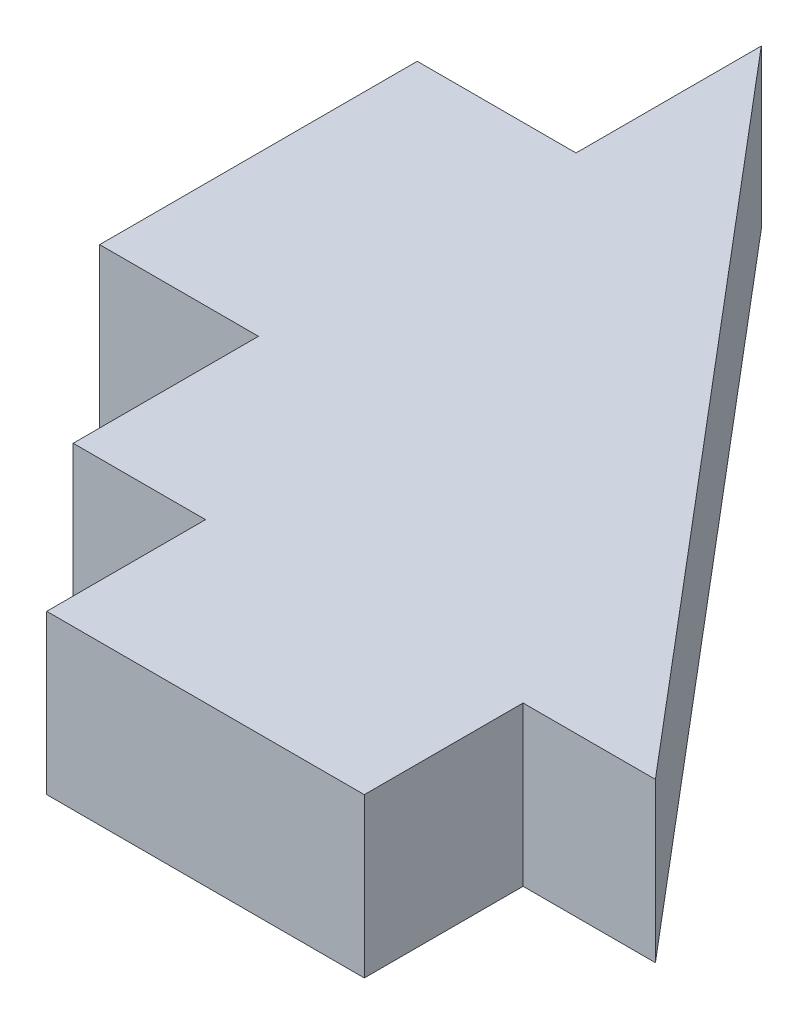
ISO-10303-21;
HEADER;
FILE_DESCRIPTION(('STEP AP214'),'2;1');
FILE_NAME('part.step','',(''),(''),'','','');
FILE_SCHEMA(('AUTOMOTIVE_DESIGN { 1 0 10303 214 1 1 1 1 }'));
ENDSEC;
DATA;
#1=APPLICATION_CONTEXT('core data for automotive mechanical design processes');
#2=APPLICATION_PROTOCOL_DEFINITION('international standard','automotive_design',2000,#1);
#3=PRODUCT_CONTEXT('',#1,'mechanical');
#4=PRODUCT('Part','Part','',(#3));
#5=PRODUCT_RELATED_PRODUCT_CATEGORY('part','',(#4));
#6=PRODUCT_DEFINITION_FORMATION('','',#4);
#7=PRODUCT_DEFINITION_CONTEXT('part definition',#1,'design');
#8=PRODUCT_DEFINITION('design','',#6,#7);
#9=PRODUCT_DEFINITION_SHAPE('','',#8);
#10=(LENGTH_UNIT() NAMED_UNIT(*) SI_UNIT(.MILLI.,.METRE.));
#11=(NAMED_UNIT(*) PLANE_ANGLE_UNIT() SI_UNIT($,.RADIAN.));
#12=(NAMED_UNIT(*) SI_UNIT($,.STERADIAN.) SOLID_ANGLE_UNIT());
#13=UNCERTAINTY_MEASURE_WITH_UNIT(LENGTH_MEASURE(1.E-05),#10,'distance_accuracy_value','');
#14=(GEOMETRIC_REPRESENTATION_CONTEXT(3) GLOBAL_UNCERTAINTY_ASSIGNED_CONTEXT((#13)) GLOBAL_UNIT_ASSIGNED_CONTEXT((#10,
#11,#12)) REPRESENTATION_CONTEXT('',''));
#15=CARTESIAN_POINT('',(0.,0.,0.));
#16=DIRECTION('',(0.,0.,1.));
#17=DIRECTION('',(1.,0.,0.));
#18=AXIS2_PLACEMENT_3D('',#15,#16,#17);
#19=CARTESIAN_POINT('',(0.,3.,0.));
#20=DIRECTION('',(1.,0.,0.));
#21=DIRECTION('',(0.,0.,-1.));
#22=AXIS2_PLACEMENT_3D('',#19,#20,#21);
#23=PLANE('',#22);
#24=DIRECTION('',(0.,0.,1.));
#25=VECTOR('',#24,1.);
#26=CARTESIAN_POINT('',(0.,0.,0.));
#27=LINE('',#26,#25);
#28=CARTESIAN_POINT('',(0.,0.,-3.5));
#29=VERTEX_POINT('',#28);
#30=CARTESIAN_POINT('',(0.,0.,0.));
#31=VERTEX_POINT('',#30);
#32=EDGE_CURVE('E147',#29,#31,#27,.T.);
#33=ORIENTED_EDGE('',*,*,#32,.T.);
#34=DIRECTION('',(0.,-1.,0.));
#35=VECTOR('',#34,1.);
#36=CARTESIAN_POINT('',(0.,3.,0.));
#37=LINE('',#36,#35);
#38=CARTESIAN_POINT('',(0.,3.,0.));
#39=VERTEX_POINT('',#38);
#40=EDGE_CURVE('E11',#39,#31,#37,.T.);
#41=ORIENTED_EDGE('',*,*,#40,.F.);
#42=DIRECTION('',(0.,0.,1.));
#43=VECTOR('',#42,1.);
#44=CARTESIAN_POINT('',(0.,3.,0.));
#45=LINE('',#44,#43);
#46=CARTESIAN_POINT('',(0.,3.,-3.5));
#47=VERTEX_POINT('',#46);
#48=EDGE_CURVE('E168',#47,#39,#45,.T.);
#49=ORIENTED_EDGE('',*,*,#48,.F.);
#50=DIRECTION('',(0.,-1.,0.));
#51=VECTOR('',#50,1.);
#52=CARTESIAN_POINT('',(0.,3.,-3.5));
#53=LINE('',#52,#51);
#54=EDGE_CURVE('E143',#47,#29,#53,.T.);
#55=ORIENTED_EDGE('',*,*,#54,.T.);
#56=EDGE_LOOP('',(#33,#41,#49,#55));
#57=FACE_BOUND('',#56,.T.);
#58=ADVANCED_FACE('F33',(#57),#23,.F.);
#59=CARTESIAN_POINT('',(0.,3.,0.));
#60=DIRECTION('',(0.,0.,-1.));
#61=DIRECTION('',(-1.,0.,0.));
#62=AXIS2_PLACEMENT_3D('',#59,#60,#61);
#63=PLANE('',#62);
#64=DIRECTION('',(1.,0.,0.));
#65=VECTOR('',#64,1.);
#66=CARTESIAN_POINT('',(0.,0.,0.));
#67=LINE('',#66,#65);
#68=CARTESIAN_POINT('',(2.5,0.,0.));
#69=VERTEX_POINT('',#68);
#70=EDGE_CURVE('E150',#31,#69,#67,.T.);
#71=ORIENTED_EDGE('',*,*,#70,.T.);
#72=DIRECTION('',(0.,-1.,0.));
#73=VECTOR('',#72,1.);
#74=CARTESIAN_POINT('',(2.5,3.,0.));
#75=LINE('',#74,#73);
#76=CARTESIAN_POINT('',(2.5,3.,0.));
#77=VERTEX_POINT('',#76);
#78=EDGE_CURVE('E41',#77,#69,#75,.T.);
#79=ORIENTED_EDGE('',*,*,#78,.F.);
#80=DIRECTION('',(1.,0.,0.));
#81=VECTOR('',#80,1.);
#82=CARTESIAN_POINT('',(0.,3.,0.));
#83=LINE('',#82,#81);
#84=EDGE_CURVE('E101',#39,#77,#83,.T.);
#85=ORIENTED_EDGE('',*,*,#84,.F.);
#86=ORIENTED_EDGE('',*,*,#40,.T.);
#87=EDGE_LOOP('',(#71,#79,#85,#86));
#88=FACE_BOUND('',#87,.T.);
#89=ADVANCED_FACE('F239',(#88),#63,.F.);
#90=CARTESIAN_POINT('',(2.5,3.,3.));
#91=DIRECTION('',(1.,0.,0.));
#92=DIRECTION('',(0.,0.,-1.));
#93=AXIS2_PLACEMENT_3D('',#90,#91,#92);
#94=PLANE('',#93);
#95=DIRECTION('',(0.,0.,1.));
#96=VECTOR('',#95,1.);
#97=CARTESIAN_POINT('',(2.5,0.,3.));
#98=LINE('',#97,#96);
#99=CARTESIAN_POINT('',(2.5,0.,3.));
#100=VERTEX_POINT('',#99);
#101=EDGE_CURVE('E152',#69,#100,#98,.T.);
#102=ORIENTED_EDGE('',*,*,#101,.T.);
#103=DIRECTION('',(0.,-1.,0.));
#104=VECTOR('',#103,1.);
#105=CARTESIAN_POINT('',(2.5,3.,3.));
#106=LINE('',#105,#104);
#107=CARTESIAN_POINT('',(2.5,3.,3.));
#108=VERTEX_POINT('',#107);
#109=EDGE_CURVE('E184',#108,#100,#106,.T.);
#110=ORIENTED_EDGE('',*,*,#109,.F.);
#111=DIRECTION('',(0.,0.,1.));
#112=VECTOR('',#111,1.);
#113=CARTESIAN_POINT('',(2.5,3.,3.));
#114=LINE('',#113,#112);
#115=EDGE_CURVE('E192',#77,#108,#114,.T.);
#116=ORIENTED_EDGE('',*,*,#115,.F.);
#117=ORIENTED_EDGE('',*,*,#78,.T.);
#118=EDGE_LOOP('',(#102,#110,#116,#117));
#119=FACE_BOUND('',#118,.T.);
#120=ADVANCED_FACE('F190',(#119),#94,.F.);
#121=CARTESIAN_POINT('',(5.5,3.,3.));
#122=DIRECTION('',(0.,0.,-1.));
#123=DIRECTION('',(-1.,0.,0.));
#124=AXIS2_PLACEMENT_3D('',#121,#122,#123);
#125=PLANE('',#124);
#126=DIRECTION('',(1.,0.,0.));
#127=VECTOR('',#126,1.);
#128=CARTESIAN_POINT('',(5.5,0.,3.));
#129=LINE('',#128,#127);
#130=CARTESIAN_POINT('',(8.5,0.,3.));
#131=VERTEX_POINT('',#130);
#132=EDGE_CURVE('E155',#100,#131,#129,.T.);
#133=ORIENTED_EDGE('',*,*,#132,.T.);
#134=DIRECTION('',(0.,-1.,0.));
#135=VECTOR('',#134,1.);
#136=CARTESIAN_POINT('',(8.5,3.,3.));
#137=LINE('',#136,#135);
#138=CARTESIAN_POINT('',(8.5,3.,3.));
#139=VERTEX_POINT('',#138);
#140=EDGE_CURVE('E181',#139,#131,#137,.T.);
#141=ORIENTED_EDGE('',*,*,#140,.F.);
#142=DIRECTION('',(1.,0.,0.));
#143=VECTOR('',#142,1.);
#144=CARTESIAN_POINT('',(5.5,3.,3.));
#145=LINE('',#144,#143);
#146=EDGE_CURVE('E209',#108,#139,#145,.T.);
#147=ORIENTED_EDGE('',*,*,#146,.F.);
#148=ORIENTED_EDGE('',*,*,#109,.T.);
#149=EDGE_LOOP('',(#133,#141,#147,#148));
#150=FACE_BOUND('',#149,.T.);
#151=ADVANCED_FACE('F200',(#150),#125,.F.);
#152=CARTESIAN_POINT('',(8.5,3.,3.));
#153=DIRECTION('',(-1.,0.,0.));
#154=DIRECTION('',(0.,0.,1.));
#155=AXIS2_PLACEMENT_3D('',#152,#153,#154);
#156=PLANE('',#155);
#157=DIRECTION('',(0.,0.,-1.));
#158=VECTOR('',#157,1.);
#159=CARTESIAN_POINT('',(8.5,0.,3.));
#160=LINE('',#159,#158);
#161=CARTESIAN_POINT('',(8.5,0.,0.));
#162=VERTEX_POINT('',#161);
#163=EDGE_CURVE('E157',#131,#162,#160,.T.);
#164=ORIENTED_EDGE('',*,*,#163,.T.);
#165=DIRECTION('',(0.,-1.,0.));
#166=VECTOR('',#165,1.);
#167=CARTESIAN_POINT('',(8.5,3.,0.));
#168=LINE('',#167,#166);
#169=CARTESIAN_POINT('',(8.5,3.,0.));
#170=VERTEX_POINT('',#169);
#171=EDGE_CURVE('E178',#170,#162,#168,.T.);
#172=ORIENTED_EDGE('',*,*,#171,.F.);
#173=DIRECTION('',(0.,0.,-1.));
#174=VECTOR('',#173,1.);
#175=CARTESIAN_POINT('',(8.5,3.,3.));
#176=LINE('',#175,#174);
#177=EDGE_CURVE('E206',#139,#170,#176,.T.);
#178=ORIENTED_EDGE('',*,*,#177,.F.);
#179=ORIENTED_EDGE('',*,*,#140,.T.);
#180=EDGE_LOOP('',(#164,#172,#178,#179));
#181=FACE_BOUND('',#180,.T.);
#182=ADVANCED_FACE('F204',(#181),#156,.F.);
#183=CARTESIAN_POINT('',(8.5,3.,0.));
#184=DIRECTION('',(0.,0.,-1.));
#185=DIRECTION('',(-1.,0.,0.));
#186=AXIS2_PLACEMENT_3D('',#183,#184,#185);
#187=PLANE('',#186);
#188=DIRECTION('',(1.,0.,0.));
#189=VECTOR('',#188,1.);
#190=CARTESIAN_POINT('',(8.5,0.,0.));
#191=LINE('',#190,#189);
#192=CARTESIAN_POINT('',(11.,0.,0.));
#193=VERTEX_POINT('',#192);
#194=EDGE_CURVE('E159',#162,#193,#191,.T.);
#195=ORIENTED_EDGE('',*,*,#194,.T.);
#196=DIRECTION('',(0.,-1.,0.));
#197=VECTOR('',#196,1.);
#198=CARTESIAN_POINT('',(11.,3.,0.));
#199=LINE('',#198,#197);
#200=CARTESIAN_POINT('',(11.,3.,0.));
#201=VERTEX_POINT('',#200);
#202=EDGE_CURVE('E175',#201,#193,#199,.T.);
#203=ORIENTED_EDGE('',*,*,#202,.F.);
#204=DIRECTION('',(1.,0.,0.));
#205=VECTOR('',#204,1.);
#206=CARTESIAN_POINT('',(8.5,3.,0.));
#207=LINE('',#206,#205);
#208=EDGE_CURVE('E208',#170,#201,#207,.T.);
#209=ORIENTED_EDGE('',*,*,#208,.F.);
#210=ORIENTED_EDGE('',*,*,#171,.T.);
#211=EDGE_LOOP('',(#195,#203,#209,#210));
#212=FACE_BOUND('',#211,.T.);
#213=ADVANCED_FACE('F252',(#212),#187,.F.);
#214=CARTESIAN_POINT('',(0.,3.,-13.));
#215=DIRECTION('',(-0.763386285369114,0.,0.645942241466174));
#216=DIRECTION('',(0.645942241466174,0.,0.763386285369115));
#217=AXIS2_PLACEMENT_3D('',#214,#215,#216);
#218=PLANE('',#217);
#219=DIRECTION('',(-0.645942241466174,0.,-0.763386285369115));
#220=VECTOR('',#219,1.);
#221=CARTESIAN_POINT('',(0.,0.,-13.));
#222=LINE('',#221,#220);
#223=CARTESIAN_POINT('',(0.,0.,-13.));
#224=VERTEX_POINT('',#223);
#225=EDGE_CURVE('E161',#193,#224,#222,.T.);
#226=ORIENTED_EDGE('',*,*,#225,.T.);
#227=DIRECTION('',(0.,-1.,0.));
#228=VECTOR('',#227,1.);
#229=CARTESIAN_POINT('',(0.,3.,-13.));
#230=LINE('',#229,#228);
#231=CARTESIAN_POINT('',(0.,3.,-13.));
#232=VERTEX_POINT('',#231);
#233=EDGE_CURVE('E172',#232,#224,#230,.T.);
#234=ORIENTED_EDGE('',*,*,#233,.F.);
#235=DIRECTION('',(-0.645942241466174,0.,-0.763386285369115));
#236=VECTOR('',#235,1.);
#237=CARTESIAN_POINT('',(0.,3.,-13.));
#238=LINE('',#237,#236);
#239=EDGE_CURVE('E211',#201,#232,#238,.T.);
#240=ORIENTED_EDGE('',*,*,#239,.F.);
#241=ORIENTED_EDGE('',*,*,#202,.T.);
#242=EDGE_LOOP('',(#226,#234,#240,#241));
#243=FACE_BOUND('',#242,.T.);
#244=ADVANCED_FACE('F220',(#243),#218,.F.);
#245=CARTESIAN_POINT('',(0.,3.,-9.5));
#246=DIRECTION('',(1.,0.,0.));
#247=DIRECTION('',(0.,0.,-1.));
#248=AXIS2_PLACEMENT_3D('',#245,#246,#247);
#249=PLANE('',#248);
#250=DIRECTION('',(0.,0.,1.));
#251=VECTOR('',#250,1.);
#252=CARTESIAN_POINT('',(0.,0.,-9.5));
#253=LINE('',#252,#251);
#254=CARTESIAN_POINT('',(0.,0.,-9.5));
#255=VERTEX_POINT('',#254);
#256=EDGE_CURVE('E163',#224,#255,#253,.T.);
#257=ORIENTED_EDGE('',*,*,#256,.T.);
#258=DIRECTION('',(0.,-1.,0.));
#259=VECTOR('',#258,1.);
#260=CARTESIAN_POINT('',(0.,3.,-9.5));
#261=LINE('',#260,#259);
#262=CARTESIAN_POINT('',(0.,3.,-9.5));
#263=VERTEX_POINT('',#262);
#264=EDGE_CURVE('E138',#263,#255,#261,.T.);
#265=ORIENTED_EDGE('',*,*,#264,.F.);
#266=DIRECTION('',(0.,0.,1.));
#267=VECTOR('',#266,1.);
#268=CARTESIAN_POINT('',(0.,3.,-9.5));
#269=LINE('',#268,#267);
#270=EDGE_CURVE('E129',#232,#263,#269,.T.);
#271=ORIENTED_EDGE('',*,*,#270,.F.);
#272=ORIENTED_EDGE('',*,*,#233,.T.);
#273=EDGE_LOOP('',(#257,#265,#271,#272));
#274=FACE_BOUND('',#273,.T.);
#275=ADVANCED_FACE('F224',(#274),#249,.F.);
#276=CARTESIAN_POINT('',(-3.,3.,-9.5));
#277=DIRECTION('',(0.,0.,1.));
#278=DIRECTION('',(1.,0.,0.));
#279=AXIS2_PLACEMENT_3D('',#276,#277,#278);
#280=PLANE('',#279);
#281=DIRECTION('',(-1.,0.,0.));
#282=VECTOR('',#281,1.);
#283=CARTESIAN_POINT('',(-3.,0.,-9.5));
#284=LINE('',#283,#282);
#285=CARTESIAN_POINT('',(-3.,0.,-9.5));
#286=VERTEX_POINT('',#285);
#287=EDGE_CURVE('E137',#255,#286,#284,.T.);
#288=ORIENTED_EDGE('',*,*,#287,.T.);
#289=DIRECTION('',(0.,-1.,0.));
#290=VECTOR('',#289,1.);
#291=CARTESIAN_POINT('',(-3.,3.,-9.5));
#292=LINE('',#291,#290);
#293=CARTESIAN_POINT('',(-3.,3.,-9.5));
#294=VERTEX_POINT('',#293);
#295=EDGE_CURVE('E134',#294,#286,#292,.T.);
#296=ORIENTED_EDGE('',*,*,#295,.F.);
#297=DIRECTION('',(-1.,0.,0.));
#298=VECTOR('',#297,1.);
#299=CARTESIAN_POINT('',(-3.,3.,-9.5));
#300=LINE('',#299,#298);
#301=EDGE_CURVE('E123',#263,#294,#300,.T.);
#302=ORIENTED_EDGE('',*,*,#301,.F.);
#303=ORIENTED_EDGE('',*,*,#264,.T.);
#304=EDGE_LOOP('',(#288,#296,#302,#303));
#305=FACE_BOUND('',#304,.T.);
#306=ADVANCED_FACE('F135',(#305),#280,.F.);
#307=CARTESIAN_POINT('',(-3.,3.,-3.5));
#308=DIRECTION('',(1.,0.,0.));
#309=DIRECTION('',(0.,0.,-1.));
#310=AXIS2_PLACEMENT_3D('',#307,#308,#309);
#311=PLANE('',#310);
#312=DIRECTION('',(0.,0.,1.));
#313=VECTOR('',#312,1.);
#314=CARTESIAN_POINT('',(-3.,0.,-3.5));
#315=LINE('',#314,#313);
#316=CARTESIAN_POINT('',(-3.,0.,-3.5));
#317=VERTEX_POINT('',#316);
#318=EDGE_CURVE('E87',#286,#317,#315,.T.);
#319=ORIENTED_EDGE('',*,*,#318,.T.);
#320=DIRECTION('',(0.,-1.,0.));
#321=VECTOR('',#320,1.);
#322=CARTESIAN_POINT('',(-3.,3.,-3.5));
#323=LINE('',#322,#321);
#324=CARTESIAN_POINT('',(-3.,3.,-3.5));
#325=VERTEX_POINT('',#324);
#326=EDGE_CURVE('E139',#325,#317,#323,.T.);
#327=ORIENTED_EDGE('',*,*,#326,.F.);
#328=DIRECTION('',(0.,0.,1.));
#329=VECTOR('',#328,1.);
#330=CARTESIAN_POINT('',(-3.,3.,-3.5));
#331=LINE('',#330,#329);
#332=EDGE_CURVE('E127',#294,#325,#331,.T.);
#333=ORIENTED_EDGE('',*,*,#332,.F.);
#334=ORIENTED_EDGE('',*,*,#295,.T.);
#335=EDGE_LOOP('',(#319,#327,#333,#334));
#336=FACE_BOUND('',#335,.T.);
#337=ADVANCED_FACE('F141',(#336),#311,.F.);
#338=CARTESIAN_POINT('',(-3.,3.,-3.5));
#339=DIRECTION('',(0.,0.,-1.));
#340=DIRECTION('',(-1.,0.,0.));
#341=AXIS2_PLACEMENT_3D('',#338,#339,#340);
#342=PLANE('',#341);
#343=DIRECTION('',(1.,0.,0.));
#344=VECTOR('',#343,1.);
#345=CARTESIAN_POINT('',(-3.,0.,-3.5));
#346=LINE('',#345,#344);
#347=EDGE_CURVE('E93',#317,#29,#346,.T.);
#348=ORIENTED_EDGE('',*,*,#347,.T.);
#349=ORIENTED_EDGE('',*,*,#54,.F.);
#350=DIRECTION('',(1.,0.,0.));
#351=VECTOR('',#350,1.);
#352=CARTESIAN_POINT('',(-3.,3.,-3.5));
#353=LINE('',#352,#351);
#354=EDGE_CURVE('E49',#325,#47,#353,.T.);
#355=ORIENTED_EDGE('',*,*,#354,.F.);
#356=ORIENTED_EDGE('',*,*,#326,.T.);
#357=EDGE_LOOP('',(#348,#349,#355,#356));
#358=FACE_BOUND('',#357,.T.);
#359=ADVANCED_FACE('F228',(#358),#342,.F.);
#360=CARTESIAN_POINT('',(0.,3.,0.));
#361=DIRECTION('',(0.,-1.,0.));
#362=DIRECTION('',(0.,0.,-1.));
#363=AXIS2_PLACEMENT_3D('',#360,#361,#362);
#364=PLANE('',#363);
#365=ORIENTED_EDGE('',*,*,#48,.T.);
#366=ORIENTED_EDGE('',*,*,#84,.T.);
#367=ORIENTED_EDGE('',*,*,#115,.T.);
#368=ORIENTED_EDGE('',*,*,#146,.T.);
#369=ORIENTED_EDGE('',*,*,#177,.T.);
#370=ORIENTED_EDGE('',*,*,#208,.T.);
#371=ORIENTED_EDGE('',*,*,#239,.T.);
#372=ORIENTED_EDGE('',*,*,#270,.T.);
#373=ORIENTED_EDGE('',*,*,#301,.T.);
#374=ORIENTED_EDGE('',*,*,#332,.T.);
#375=ORIENTED_EDGE('',*,*,#354,.T.);
#376=EDGE_LOOP('',(#365,#366,#367,#368,#369,#370,#371,#372,#373,#374,#375));
#377=FACE_BOUND('',#376,.T.);
#378=ADVANCED_FACE('F125',(#377),#364,.F.);
#379=CARTESIAN_POINT('',(0.,0.,0.));
#380=DIRECTION('',(0.,-1.,0.));
#381=DIRECTION('',(0.,0.,-1.));
#382=AXIS2_PLACEMENT_3D('',#379,#380,#381);
#383=PLANE('',#382);
#384=ORIENTED_EDGE('',*,*,#32,.F.);
#385=ORIENTED_EDGE('',*,*,#347,.F.);
#386=ORIENTED_EDGE('',*,*,#318,.F.);
#387=ORIENTED_EDGE('',*,*,#287,.F.);
#388=ORIENTED_EDGE('',*,*,#256,.F.);
#389=ORIENTED_EDGE('',*,*,#225,.F.);
#390=ORIENTED_EDGE('',*,*,#194,.F.);
#391=ORIENTED_EDGE('',*,*,#163,.F.);
#392=ORIENTED_EDGE('',*,*,#132,.F.);
#393=ORIENTED_EDGE('',*,*,#101,.F.);
#394=ORIENTED_EDGE('',*,*,#70,.F.);
#395=EDGE_LOOP('',(#384,#385,#386,#387,#388,#389,#390,#391,#392,#393,#394));
#396=FACE_BOUND('',#395,.T.);
#397=ADVANCED_FACE('F195',(#396),#383,.T.);
#398=CLOSED_SHELL('',(#58,#89,#120,#151,#182,#213,#244,#275,#306,#337,#359,#378,#397));
#399=MANIFOLD_SOLID_BREP('B2',#398);
#400=ADVANCED_BREP_SHAPE_REPRESENTATION('',(#18,#399),#14);
#401=SHAPE_DEFINITION_REPRESENTATION(#9,#400);
ENDSEC;
END-ISO-10303-21;
